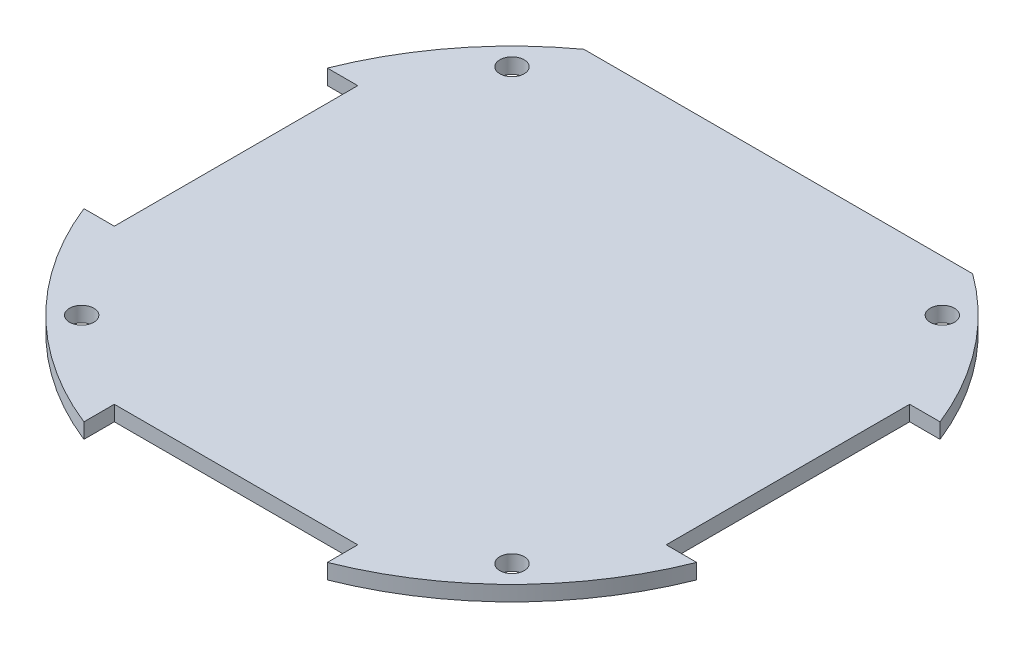
ISO-10303-21;
HEADER;
FILE_DESCRIPTION(('STEP AP214'),'2;1');
FILE_NAME('part.step','',(''),(''),'','','');
FILE_SCHEMA(('AUTOMOTIVE_DESIGN { 1 0 10303 214 1 1 1 1 }'));
ENDSEC;
DATA;
#1=APPLICATION_CONTEXT('core data for automotive mechanical design processes');
#2=APPLICATION_PROTOCOL_DEFINITION('international standard','automotive_design',2000,#1);
#3=PRODUCT_CONTEXT('',#1,'mechanical');
#4=PRODUCT('Part','Part','',(#3));
#5=PRODUCT_RELATED_PRODUCT_CATEGORY('part','',(#4));
#6=PRODUCT_DEFINITION_FORMATION('','',#4);
#7=PRODUCT_DEFINITION_CONTEXT('part definition',#1,'design');
#8=PRODUCT_DEFINITION('design','',#6,#7);
#9=PRODUCT_DEFINITION_SHAPE('','',#8);
#10=(LENGTH_UNIT() NAMED_UNIT(*) SI_UNIT(.MILLI.,.METRE.));
#11=(NAMED_UNIT(*) PLANE_ANGLE_UNIT() SI_UNIT($,.RADIAN.));
#12=(NAMED_UNIT(*) SI_UNIT($,.STERADIAN.) SOLID_ANGLE_UNIT());
#13=UNCERTAINTY_MEASURE_WITH_UNIT(LENGTH_MEASURE(1.E-05),#10,'distance_accuracy_value','');
#14=(GEOMETRIC_REPRESENTATION_CONTEXT(3) GLOBAL_UNCERTAINTY_ASSIGNED_CONTEXT((#13)) GLOBAL_UNIT_ASSIGNED_CONTEXT((#10,
#11,#12)) REPRESENTATION_CONTEXT('',''));
#15=CARTESIAN_POINT('',(0.,0.,0.));
#16=DIRECTION('',(0.,0.,1.));
#17=DIRECTION('',(1.,0.,0.));
#18=AXIS2_PLACEMENT_3D('',#15,#16,#17);
#19=CARTESIAN_POINT('',(0.,1.5,0.));
#20=DIRECTION('',(0.,-1.,0.));
#21=DIRECTION('',(0.,0.,-1.));
#22=AXIS2_PLACEMENT_3D('',#19,#20,#21);
#23=CYLINDRICAL_SURFACE('',#22,32.5);
#24=CARTESIAN_POINT('',(0.,0.,0.));
#25=DIRECTION('',(0.,1.,0.));
#26=DIRECTION('',(0.,0.,1.));
#27=AXIS2_PLACEMENT_3D('',#24,#25,#26);
#28=CIRCLE('',#27,32.5);
#29=CARTESIAN_POINT('',(11.9999999999999,0.,30.203476621078));
#30=VERTEX_POINT('',#29);
#31=CARTESIAN_POINT('',(30.2034766210779,0.,12.));
#32=VERTEX_POINT('',#31);
#33=EDGE_CURVE('E168',#30,#32,#28,.T.);
#34=ORIENTED_EDGE('',*,*,#33,.T.);
#35=DIRECTION('',(0.,1.,0.));
#36=VECTOR('',#35,1.);
#37=CARTESIAN_POINT('',(30.2034766210779,0.,12.));
#38=LINE('',#37,#36);
#39=CARTESIAN_POINT('',(30.2034766210779,1.5,12.));
#40=VERTEX_POINT('',#39);
#41=EDGE_CURVE('E190',#32,#40,#38,.T.);
#42=ORIENTED_EDGE('',*,*,#41,.T.);
#43=CARTESIAN_POINT('',(0.,1.5,0.));
#44=DIRECTION('',(0.,1.,0.));
#45=DIRECTION('',(0.,0.,1.));
#46=AXIS2_PLACEMENT_3D('',#43,#44,#45);
#47=CIRCLE('',#46,32.5);
#48=CARTESIAN_POINT('',(11.9999999999999,1.5,30.203476621078));
#49=VERTEX_POINT('',#48);
#50=EDGE_CURVE('E52',#49,#40,#47,.T.);
#51=ORIENTED_EDGE('',*,*,#50,.F.);
#52=DIRECTION('',(0.,1.,0.));
#53=VECTOR('',#52,1.);
#54=CARTESIAN_POINT('',(11.9999999999999,0.,30.203476621078));
#55=LINE('',#54,#53);
#56=EDGE_CURVE('E183',#30,#49,#55,.T.);
#57=ORIENTED_EDGE('',*,*,#56,.F.);
#58=EDGE_LOOP('',(#34,#42,#51,#57));
#59=FACE_BOUND('',#58,.T.);
#60=ADVANCED_FACE('F44',(#59),#23,.T.);
#61=CARTESIAN_POINT('',(-30.203476621078,0.,11.9999999999998));
#62=VERTEX_POINT('',#61);
#63=CARTESIAN_POINT('',(-12.0000000000001,0.,30.2034766210779));
#64=VERTEX_POINT('',#63);
#65=EDGE_CURVE('E267',#62,#64,#28,.T.);
#66=ORIENTED_EDGE('',*,*,#65,.T.);
#67=DIRECTION('',(0.,1.,0.));
#68=VECTOR('',#67,1.);
#69=CARTESIAN_POINT('',(-12.0000000000001,0.,30.2034766210779));
#70=LINE('',#69,#68);
#71=CARTESIAN_POINT('',(-12.0000000000001,1.5,30.2034766210779));
#72=VERTEX_POINT('',#71);
#73=EDGE_CURVE('E215',#64,#72,#70,.T.);
#74=ORIENTED_EDGE('',*,*,#73,.T.);
#75=CARTESIAN_POINT('',(-30.203476621078,1.5,11.9999999999998));
#76=VERTEX_POINT('',#75);
#77=EDGE_CURVE('E170',#76,#72,#47,.T.);
#78=ORIENTED_EDGE('',*,*,#77,.F.);
#79=DIRECTION('',(0.,1.,0.));
#80=VECTOR('',#79,1.);
#81=CARTESIAN_POINT('',(-30.203476621078,0.,11.9999999999998));
#82=LINE('',#81,#80);
#83=EDGE_CURVE('E233',#62,#76,#82,.T.);
#84=ORIENTED_EDGE('',*,*,#83,.F.);
#85=EDGE_LOOP('',(#66,#74,#78,#84));
#86=FACE_BOUND('',#85,.T.);
#87=ADVANCED_FACE('F292',(#86),#23,.T.);
#88=CARTESIAN_POINT('',(-19.1621371459443,1.5,-26.2500000000004));
#89=VERTEX_POINT('',#88);
#90=CARTESIAN_POINT('',(-30.2034766210778,1.5,-12.0000000000002));
#91=VERTEX_POINT('',#90);
#92=EDGE_CURVE('E160',#89,#91,#47,.T.);
#93=ORIENTED_EDGE('',*,*,#92,.F.);
#94=DIRECTION('',(0.,-1.,0.));
#95=VECTOR('',#94,1.);
#96=CARTESIAN_POINT('',(-19.1621371459443,1.5,-26.2500000000004));
#97=LINE('',#96,#95);
#98=CARTESIAN_POINT('',(-19.1621371459443,0.,-26.2499999999999));
#99=VERTEX_POINT('',#98);
#100=EDGE_CURVE('E141',#89,#99,#97,.T.);
#101=ORIENTED_EDGE('',*,*,#100,.T.);
#102=CARTESIAN_POINT('',(-30.2034766210778,0.,-12.0000000000002));
#103=VERTEX_POINT('',#102);
#104=EDGE_CURVE('E304',#99,#103,#28,.T.);
#105=ORIENTED_EDGE('',*,*,#104,.T.);
#106=DIRECTION('',(0.,1.,0.));
#107=VECTOR('',#106,1.);
#108=CARTESIAN_POINT('',(-30.2034766210778,0.,-12.0000000000002));
#109=LINE('',#108,#107);
#110=EDGE_CURVE('E147',#103,#91,#109,.T.);
#111=ORIENTED_EDGE('',*,*,#110,.T.);
#112=EDGE_LOOP('',(#93,#101,#105,#111));
#113=FACE_BOUND('',#112,.T.);
#114=ADVANCED_FACE('F164',(#113),#23,.T.);
#115=CARTESIAN_POINT('',(0.,1.5,0.));
#116=DIRECTION('',(0.,1.,0.));
#117=DIRECTION('',(0.,0.,1.));
#118=AXIS2_PLACEMENT_3D('',#115,#116,#117);
#119=PLANE('',#118);
#120=DIRECTION('',(1.,0.,0.));
#121=VECTOR('',#120,1.);
#122=CARTESIAN_POINT('',(16.9999999999999,1.5,-26.2499999999999));
#123=LINE('',#122,#121);
#124=CARTESIAN_POINT('',(19.162137145945,1.5,-26.2499999999999));
#125=VERTEX_POINT('',#124);
#126=EDGE_CURVE('E58',#89,#125,#123,.T.);
#127=ORIENTED_EDGE('',*,*,#126,.F.);
#128=ORIENTED_EDGE('',*,*,#92,.T.);
#129=DIRECTION('',(-1.,0.,0.));
#130=VECTOR('',#129,1.);
#131=CARTESIAN_POINT('',(-30.2034766210778,1.5,-12.0000000000002));
#132=LINE('',#131,#130);
#133=CARTESIAN_POINT('',(-27.2034766210778,1.5,-12.0000000000002));
#134=VERTEX_POINT('',#133);
#135=EDGE_CURVE('E239',#134,#91,#132,.T.);
#136=ORIENTED_EDGE('',*,*,#135,.F.);
#137=DIRECTION('',(0.,0.,-1.));
#138=VECTOR('',#137,1.);
#139=CARTESIAN_POINT('',(-27.203476621078,1.5,11.9999999999998));
#140=LINE('',#139,#138);
#141=CARTESIAN_POINT('',(-27.203476621078,1.5,11.9999999999998));
#142=VERTEX_POINT('',#141);
#143=EDGE_CURVE('E243',#142,#134,#140,.T.);
#144=ORIENTED_EDGE('',*,*,#143,.F.);
#145=DIRECTION('',(1.,0.,0.));
#146=VECTOR('',#145,1.);
#147=CARTESIAN_POINT('',(-30.203476621078,1.5,11.9999999999998));
#148=LINE('',#147,#146);
#149=EDGE_CURVE('E214',#76,#142,#148,.T.);
#150=ORIENTED_EDGE('',*,*,#149,.F.);
#151=ORIENTED_EDGE('',*,*,#77,.T.);
#152=DIRECTION('',(0.,0.,1.));
#153=VECTOR('',#152,1.);
#154=CARTESIAN_POINT('',(-12.0000000000001,1.5,30.2034766210779));
#155=LINE('',#154,#153);
#156=CARTESIAN_POINT('',(-12.0000000000001,1.5,27.2034766210779));
#157=VERTEX_POINT('',#156);
#158=EDGE_CURVE('E216',#157,#72,#155,.T.);
#159=ORIENTED_EDGE('',*,*,#158,.F.);
#160=DIRECTION('',(-1.,0.,0.));
#161=VECTOR('',#160,1.);
#162=CARTESIAN_POINT('',(11.9999999999999,1.5,27.203476621078));
#163=LINE('',#162,#161);
#164=CARTESIAN_POINT('',(11.9999999999999,1.5,27.203476621078));
#165=VERTEX_POINT('',#164);
#166=EDGE_CURVE('E217',#165,#157,#163,.T.);
#167=ORIENTED_EDGE('',*,*,#166,.F.);
#168=DIRECTION('',(0.,0.,-1.));
#169=VECTOR('',#168,1.);
#170=CARTESIAN_POINT('',(11.9999999999999,1.5,30.203476621078));
#171=LINE('',#170,#169);
#172=EDGE_CURVE('E179',#49,#165,#171,.T.);
#173=ORIENTED_EDGE('',*,*,#172,.F.);
#174=ORIENTED_EDGE('',*,*,#50,.T.);
#175=DIRECTION('',(1.,0.,0.));
#176=VECTOR('',#175,1.);
#177=CARTESIAN_POINT('',(30.2034766210779,1.5,12.));
#178=LINE('',#177,#176);
#179=CARTESIAN_POINT('',(27.2034766210779,1.5,12.));
#180=VERTEX_POINT('',#179);
#181=EDGE_CURVE('E180',#180,#40,#178,.T.);
#182=ORIENTED_EDGE('',*,*,#181,.F.);
#183=DIRECTION('',(0.,0.,1.));
#184=VECTOR('',#183,1.);
#185=CARTESIAN_POINT('',(27.2034766210779,1.5,-12.));
#186=LINE('',#185,#184);
#187=CARTESIAN_POINT('',(27.2034766210779,1.5,-12.));
#188=VERTEX_POINT('',#187);
#189=EDGE_CURVE('E323',#188,#180,#186,.T.);
#190=ORIENTED_EDGE('',*,*,#189,.F.);
#191=DIRECTION('',(-1.,0.,0.));
#192=VECTOR('',#191,1.);
#193=CARTESIAN_POINT('',(30.2034766210779,1.5,-12.));
#194=LINE('',#193,#192);
#195=CARTESIAN_POINT('',(30.2034766210779,1.5,-12.));
#196=VERTEX_POINT('',#195);
#197=EDGE_CURVE('E224',#196,#188,#194,.T.);
#198=ORIENTED_EDGE('',*,*,#197,.F.);
#199=EDGE_CURVE('E161',#196,#125,#47,.T.);
#200=ORIENTED_EDGE('',*,*,#199,.T.);
#201=EDGE_LOOP('',(#127,#128,#136,#144,#150,#151,#159,#167,#173,#174,#182,#190,#198,#200));
#202=FACE_BOUND('',#201,.T.);
#203=CARTESIAN_POINT('',(-21.2132034355974,1.5,21.2132034355974));
#204=DIRECTION('',(0.,1.,0.));
#205=DIRECTION('',(0.,0.,1.));
#206=AXIS2_PLACEMENT_3D('',#203,#204,#205);
#207=CIRCLE('',#206,1.19999999999986);
#208=CARTESIAN_POINT('',(-21.2132034355974,1.5,22.4132034355973));
#209=VERTEX_POINT('',#208);
#210=EDGE_CURVE('E254',#209,#209,#207,.T.);
#211=ORIENTED_EDGE('',*,*,#210,.F.);
#212=EDGE_LOOP('',(#211));
#213=FACE_BOUND('',#212,.T.);
#214=CARTESIAN_POINT('',(21.2132034355968,1.5,-21.213203435596));
#215=DIRECTION('',(0.,1.,0.));
#216=DIRECTION('',(0.,0.,1.));
#217=AXIS2_PLACEMENT_3D('',#214,#215,#216);
#218=CIRCLE('',#217,1.2);
#219=CARTESIAN_POINT('',(21.2132034355968,1.5,-20.013203435596));
#220=VERTEX_POINT('',#219);
#221=EDGE_CURVE('E270',#220,#220,#218,.T.);
#222=ORIENTED_EDGE('',*,*,#221,.F.);
#223=EDGE_LOOP('',(#222));
#224=FACE_BOUND('',#223,.T.);
#225=CARTESIAN_POINT('',(21.2132034355964,1.5,21.2132034355978));
#226=DIRECTION('',(0.,1.,0.));
#227=DIRECTION('',(0.,0.,1.));
#228=AXIS2_PLACEMENT_3D('',#225,#226,#227);
#229=CIRCLE('',#228,1.19999999999894);
#230=CARTESIAN_POINT('',(21.2132034355964,1.5,22.4132034355967));
#231=VERTEX_POINT('',#230);
#232=EDGE_CURVE('E261',#231,#231,#229,.T.);
#233=ORIENTED_EDGE('',*,*,#232,.F.);
#234=EDGE_LOOP('',(#233));
#235=FACE_BOUND('',#234,.T.);
#236=CARTESIAN_POINT('',(-21.213203435597,1.5,-21.2132034355964));
#237=DIRECTION('',(0.,1.,0.));
#238=DIRECTION('',(0.,0.,1.));
#239=AXIS2_PLACEMENT_3D('',#236,#237,#238);
#240=CIRCLE('',#239,1.20000000000061);
#241=CARTESIAN_POINT('',(-21.213203435597,1.5,-20.0132034355958));
#242=VERTEX_POINT('',#241);
#243=EDGE_CURVE('E194',#242,#242,#240,.T.);
#244=ORIENTED_EDGE('',*,*,#243,.F.);
#245=EDGE_LOOP('',(#244));
#246=FACE_BOUND('',#245,.T.);
#247=ADVANCED_FACE('F152',(#202,#213,#224,#235,#246),#119,.T.);
#248=CARTESIAN_POINT('',(0.,0.,0.));
#249=DIRECTION('',(0.,1.,0.));
#250=DIRECTION('',(0.,0.,1.));
#251=AXIS2_PLACEMENT_3D('',#248,#249,#250);
#252=PLANE('',#251);
#253=CARTESIAN_POINT('',(-2.99999999999997,0.,21.203476621078));
#254=DIRECTION('',(0.,-1.,0.));
#255=DIRECTION('',(0.,0.,-1.));
#256=AXIS2_PLACEMENT_3D('',#253,#254,#255);
#257=CIRCLE('',#256,1.);
#258=CARTESIAN_POINT('',(-2.99999999999997,0.,20.203476621078));
#259=VERTEX_POINT('',#258);
#260=EDGE_CURVE('E378',#259,#259,#257,.T.);
#261=ORIENTED_EDGE('',*,*,#260,.F.);
#262=EDGE_LOOP('',(#261));
#263=FACE_BOUND('',#262,.T.);
#264=CARTESIAN_POINT('',(-3.,0.,24.203476621078));
#265=DIRECTION('',(0.,-1.,0.));
#266=DIRECTION('',(0.,0.,-1.));
#267=AXIS2_PLACEMENT_3D('',#264,#265,#266);
#268=CIRCLE('',#267,1.);
#269=CARTESIAN_POINT('',(-3.,0.,23.203476621078));
#270=VERTEX_POINT('',#269);
#271=EDGE_CURVE('E385',#270,#270,#268,.T.);
#272=ORIENTED_EDGE('',*,*,#271,.F.);
#273=EDGE_LOOP('',(#272));
#274=FACE_BOUND('',#273,.T.);
#275=CARTESIAN_POINT('',(-6.,0.,24.203476621078));
#276=DIRECTION('',(0.,-1.,0.));
#277=DIRECTION('',(0.,0.,-1.));
#278=AXIS2_PLACEMENT_3D('',#275,#276,#277);
#279=CIRCLE('',#278,1.);
#280=CARTESIAN_POINT('',(-6.,0.,23.203476621078));
#281=VERTEX_POINT('',#280);
#282=EDGE_CURVE('E387',#281,#281,#279,.T.);
#283=ORIENTED_EDGE('',*,*,#282,.F.);
#284=EDGE_LOOP('',(#283));
#285=FACE_BOUND('',#284,.T.);
#286=CARTESIAN_POINT('',(3.,0.,18.203476621078));
#287=DIRECTION('',(0.,-1.,0.));
#288=DIRECTION('',(0.,0.,-1.));
#289=AXIS2_PLACEMENT_3D('',#286,#287,#288);
#290=CIRCLE('',#289,1.5);
#291=CARTESIAN_POINT('',(3.,0.,16.703476621078));
#292=VERTEX_POINT('',#291);
#293=EDGE_CURVE('E388',#292,#292,#290,.T.);
#294=ORIENTED_EDGE('',*,*,#293,.F.);
#295=EDGE_LOOP('',(#294));
#296=FACE_BOUND('',#295,.T.);
#297=CARTESIAN_POINT('',(-5.99999999999997,0.,21.203476621078));
#298=DIRECTION('',(0.,-1.,0.));
#299=DIRECTION('',(0.,0.,-1.));
#300=AXIS2_PLACEMENT_3D('',#297,#298,#299);
#301=CIRCLE('',#300,1.);
#302=CARTESIAN_POINT('',(-5.99999999999997,0.,20.203476621078));
#303=VERTEX_POINT('',#302);
#304=EDGE_CURVE('E394',#303,#303,#301,.T.);
#305=ORIENTED_EDGE('',*,*,#304,.F.);
#306=EDGE_LOOP('',(#305));
#307=FACE_BOUND('',#306,.T.);
#308=CARTESIAN_POINT('',(3.,0.,22.203476621078));
#309=DIRECTION('',(0.,-1.,0.));
#310=DIRECTION('',(0.,0.,-1.));
#311=AXIS2_PLACEMENT_3D('',#308,#309,#310);
#312=CIRCLE('',#311,1.5);
#313=CARTESIAN_POINT('',(3.,0.,20.703476621078));
#314=VERTEX_POINT('',#313);
#315=EDGE_CURVE('E312',#314,#314,#312,.T.);
#316=ORIENTED_EDGE('',*,*,#315,.F.);
#317=EDGE_LOOP('',(#316));
#318=FACE_BOUND('',#317,.T.);
#319=ORIENTED_EDGE('',*,*,#104,.F.);
#320=DIRECTION('',(1.,0.,0.));
#321=VECTOR('',#320,1.);
#322=CARTESIAN_POINT('',(16.9999999999999,0.,-26.2499999999999));
#323=LINE('',#322,#321);
#324=CARTESIAN_POINT('',(19.162137145945,0.,-26.2499999999999));
#325=VERTEX_POINT('',#324);
#326=EDGE_CURVE('E148',#99,#325,#323,.T.);
#327=ORIENTED_EDGE('',*,*,#326,.T.);
#328=CARTESIAN_POINT('',(30.2034766210779,0.,-12.));
#329=VERTEX_POINT('',#328);
#330=EDGE_CURVE('E308',#329,#325,#28,.T.);
#331=ORIENTED_EDGE('',*,*,#330,.F.);
#332=DIRECTION('',(-1.,0.,0.));
#333=VECTOR('',#332,1.);
#334=CARTESIAN_POINT('',(30.2034766210779,0.,-12.));
#335=LINE('',#334,#333);
#336=CARTESIAN_POINT('',(27.2034766210779,0.,-12.));
#337=VERTEX_POINT('',#336);
#338=EDGE_CURVE('E315',#329,#337,#335,.T.);
#339=ORIENTED_EDGE('',*,*,#338,.T.);
#340=DIRECTION('',(0.,0.,1.));
#341=VECTOR('',#340,1.);
#342=CARTESIAN_POINT('',(27.2034766210779,0.,-12.));
#343=LINE('',#342,#341);
#344=CARTESIAN_POINT('',(27.2034766210779,0.,12.));
#345=VERTEX_POINT('',#344);
#346=EDGE_CURVE('E317',#337,#345,#343,.T.);
#347=ORIENTED_EDGE('',*,*,#346,.T.);
#348=DIRECTION('',(1.,0.,0.));
#349=VECTOR('',#348,1.);
#350=CARTESIAN_POINT('',(30.2034766210779,0.,12.));
#351=LINE('',#350,#349);
#352=EDGE_CURVE('E202',#345,#32,#351,.T.);
#353=ORIENTED_EDGE('',*,*,#352,.T.);
#354=ORIENTED_EDGE('',*,*,#33,.F.);
#355=DIRECTION('',(0.,0.,-1.));
#356=VECTOR('',#355,1.);
#357=CARTESIAN_POINT('',(11.9999999999999,0.,30.203476621078));
#358=LINE('',#357,#356);
#359=CARTESIAN_POINT('',(11.9999999999999,0.,27.203476621078));
#360=VERTEX_POINT('',#359);
#361=EDGE_CURVE('E218',#30,#360,#358,.T.);
#362=ORIENTED_EDGE('',*,*,#361,.T.);
#363=DIRECTION('',(-1.,0.,0.));
#364=VECTOR('',#363,1.);
#365=CARTESIAN_POINT('',(11.9999999999999,0.,27.203476621078));
#366=LINE('',#365,#364);
#367=CARTESIAN_POINT('',(-12.0000000000001,0.,27.2034766210779));
#368=VERTEX_POINT('',#367);
#369=EDGE_CURVE('E228',#360,#368,#366,.T.);
#370=ORIENTED_EDGE('',*,*,#369,.T.);
#371=DIRECTION('',(0.,0.,1.));
#372=VECTOR('',#371,1.);
#373=CARTESIAN_POINT('',(-12.0000000000001,0.,30.2034766210779));
#374=LINE('',#373,#372);
#375=EDGE_CURVE('E210',#368,#64,#374,.T.);
#376=ORIENTED_EDGE('',*,*,#375,.T.);
#377=ORIENTED_EDGE('',*,*,#65,.F.);
#378=DIRECTION('',(1.,0.,0.));
#379=VECTOR('',#378,1.);
#380=CARTESIAN_POINT('',(-30.203476621078,0.,11.9999999999998));
#381=LINE('',#380,#379);
#382=CARTESIAN_POINT('',(-27.203476621078,0.,11.9999999999998));
#383=VERTEX_POINT('',#382);
#384=EDGE_CURVE('E70',#62,#383,#381,.T.);
#385=ORIENTED_EDGE('',*,*,#384,.T.);
#386=DIRECTION('',(0.,0.,-1.));
#387=VECTOR('',#386,1.);
#388=CARTESIAN_POINT('',(-27.203476621078,0.,11.9999999999998));
#389=LINE('',#388,#387);
#390=CARTESIAN_POINT('',(-27.2034766210778,0.,-12.0000000000002));
#391=VERTEX_POINT('',#390);
#392=EDGE_CURVE('E246',#383,#391,#389,.T.);
#393=ORIENTED_EDGE('',*,*,#392,.T.);
#394=DIRECTION('',(-1.,0.,0.));
#395=VECTOR('',#394,1.);
#396=CARTESIAN_POINT('',(-30.2034766210778,0.,-12.0000000000002));
#397=LINE('',#396,#395);
#398=EDGE_CURVE('E231',#391,#103,#397,.T.);
#399=ORIENTED_EDGE('',*,*,#398,.T.);
#400=EDGE_LOOP('',(#319,#327,#331,#339,#347,#353,#354,#362,#370,#376,#377,#385,#393,#399));
#401=FACE_BOUND('',#400,.T.);
#402=CARTESIAN_POINT('',(21.2132034355968,0.,-21.213203435596));
#403=DIRECTION('',(0.,1.,0.));
#404=DIRECTION('',(0.,0.,1.));
#405=AXIS2_PLACEMENT_3D('',#402,#403,#404);
#406=CIRCLE('',#405,1.2);
#407=CARTESIAN_POINT('',(21.2132034355968,0.,-20.013203435596));
#408=VERTEX_POINT('',#407);
#409=EDGE_CURVE('E262',#408,#408,#406,.T.);
#410=ORIENTED_EDGE('',*,*,#409,.T.);
#411=EDGE_LOOP('',(#410));
#412=FACE_BOUND('',#411,.T.);
#413=CARTESIAN_POINT('',(21.2132034355964,0.,21.2132034355978));
#414=DIRECTION('',(0.,1.,0.));
#415=DIRECTION('',(0.,0.,1.));
#416=AXIS2_PLACEMENT_3D('',#413,#414,#415);
#417=CIRCLE('',#416,1.19999999999894);
#418=CARTESIAN_POINT('',(21.2132034355964,0.,22.4132034355967));
#419=VERTEX_POINT('',#418);
#420=EDGE_CURVE('E256',#419,#419,#417,.T.);
#421=ORIENTED_EDGE('',*,*,#420,.T.);
#422=EDGE_LOOP('',(#421));
#423=FACE_BOUND('',#422,.T.);
#424=CARTESIAN_POINT('',(-21.2132034355974,0.,21.2132034355974));
#425=DIRECTION('',(0.,1.,0.));
#426=DIRECTION('',(0.,0.,1.));
#427=AXIS2_PLACEMENT_3D('',#424,#425,#426);
#428=CIRCLE('',#427,1.19999999999986);
#429=CARTESIAN_POINT('',(-21.2132034355974,0.,22.4132034355973));
#430=VERTEX_POINT('',#429);
#431=EDGE_CURVE('E251',#430,#430,#428,.T.);
#432=ORIENTED_EDGE('',*,*,#431,.T.);
#433=EDGE_LOOP('',(#432));
#434=FACE_BOUND('',#433,.T.);
#435=CARTESIAN_POINT('',(-21.213203435597,0.,-21.2132034355964));
#436=DIRECTION('',(0.,1.,0.));
#437=DIRECTION('',(0.,0.,1.));
#438=AXIS2_PLACEMENT_3D('',#435,#436,#437);
#439=CIRCLE('',#438,1.20000000000061);
#440=CARTESIAN_POINT('',(-21.213203435597,0.,-20.0132034355958));
#441=VERTEX_POINT('',#440);
#442=EDGE_CURVE('E193',#441,#441,#439,.T.);
#443=ORIENTED_EDGE('',*,*,#442,.T.);
#444=EDGE_LOOP('',(#443));
#445=FACE_BOUND('',#444,.T.);
#446=ADVANCED_FACE('F272',(#263,#274,#285,#296,#307,#318,#401,#412,#423,#434,#445),#252,.F.);
#447=ORIENTED_EDGE('',*,*,#330,.T.);
#448=DIRECTION('',(0.,-1.,0.));
#449=VECTOR('',#448,1.);
#450=CARTESIAN_POINT('',(19.162137145945,1.5,-26.2499999999999));
#451=LINE('',#450,#449);
#452=EDGE_CURVE('E11',#325,#125,#451,.F.);
#453=ORIENTED_EDGE('',*,*,#452,.T.);
#454=ORIENTED_EDGE('',*,*,#199,.F.);
#455=DIRECTION('',(0.,1.,0.));
#456=VECTOR('',#455,1.);
#457=CARTESIAN_POINT('',(30.2034766210779,0.,-12.));
#458=LINE('',#457,#456);
#459=EDGE_CURVE('E201',#329,#196,#458,.T.);
#460=ORIENTED_EDGE('',*,*,#459,.F.);
#461=EDGE_LOOP('',(#447,#453,#454,#460));
#462=FACE_BOUND('',#461,.T.);
#463=ADVANCED_FACE('F50',(#462),#23,.T.);
#464=CARTESIAN_POINT('',(21.2132034355968,1.5,-21.213203435596));
#465=DIRECTION('',(0.,-1.,0.));
#466=DIRECTION('',(0.,0.,-1.));
#467=AXIS2_PLACEMENT_3D('',#464,#465,#466);
#468=CYLINDRICAL_SURFACE('',#467,1.2);
#469=ORIENTED_EDGE('',*,*,#221,.T.);
#470=EDGE_LOOP('',(#469));
#471=FACE_BOUND('',#470,.T.);
#472=ORIENTED_EDGE('',*,*,#409,.F.);
#473=EDGE_LOOP('',(#472));
#474=FACE_BOUND('',#473,.T.);
#475=ADVANCED_FACE('F277',(#471,#474),#468,.F.);
#476=CARTESIAN_POINT('',(21.2132034355964,1.5,21.2132034355978));
#477=DIRECTION('',(0.,-1.,0.));
#478=DIRECTION('',(0.,0.,-1.));
#479=AXIS2_PLACEMENT_3D('',#476,#477,#478);
#480=CYLINDRICAL_SURFACE('',#479,1.19999999999894);
#481=ORIENTED_EDGE('',*,*,#232,.T.);
#482=EDGE_LOOP('',(#481));
#483=FACE_BOUND('',#482,.T.);
#484=ORIENTED_EDGE('',*,*,#420,.F.);
#485=EDGE_LOOP('',(#484));
#486=FACE_BOUND('',#485,.T.);
#487=ADVANCED_FACE('F279',(#483,#486),#480,.F.);
#488=CARTESIAN_POINT('',(-21.2132034355974,1.5,21.2132034355974));
#489=DIRECTION('',(0.,-1.,0.));
#490=DIRECTION('',(0.,0.,-1.));
#491=AXIS2_PLACEMENT_3D('',#488,#489,#490);
#492=CYLINDRICAL_SURFACE('',#491,1.19999999999986);
#493=ORIENTED_EDGE('',*,*,#210,.T.);
#494=EDGE_LOOP('',(#493));
#495=FACE_BOUND('',#494,.T.);
#496=ORIENTED_EDGE('',*,*,#431,.F.);
#497=EDGE_LOOP('',(#496));
#498=FACE_BOUND('',#497,.T.);
#499=ADVANCED_FACE('F284',(#495,#498),#492,.F.);
#500=CARTESIAN_POINT('',(-21.213203435597,1.5,-21.2132034355964));
#501=DIRECTION('',(0.,-1.,0.));
#502=DIRECTION('',(0.,0.,-1.));
#503=AXIS2_PLACEMENT_3D('',#500,#501,#502);
#504=CYLINDRICAL_SURFACE('',#503,1.20000000000061);
#505=ORIENTED_EDGE('',*,*,#243,.T.);
#506=EDGE_LOOP('',(#505));
#507=FACE_BOUND('',#506,.T.);
#508=ORIENTED_EDGE('',*,*,#442,.F.);
#509=EDGE_LOOP('',(#508));
#510=FACE_BOUND('',#509,.T.);
#511=ADVANCED_FACE('F350',(#507,#510),#504,.F.);
#512=CARTESIAN_POINT('',(-30.2034766210778,0.,-12.0000000000002));
#513=DIRECTION('',(0.,0.,-1.));
#514=DIRECTION('',(-1.,0.,0.));
#515=AXIS2_PLACEMENT_3D('',#512,#513,#514);
#516=PLANE('',#515);
#517=ORIENTED_EDGE('',*,*,#135,.T.);
#518=ORIENTED_EDGE('',*,*,#110,.F.);
#519=ORIENTED_EDGE('',*,*,#398,.F.);
#520=DIRECTION('',(0.,1.,0.));
#521=VECTOR('',#520,1.);
#522=CARTESIAN_POINT('',(-27.2034766210778,0.,-12.0000000000002));
#523=LINE('',#522,#521);
#524=EDGE_CURVE('E237',#391,#134,#523,.T.);
#525=ORIENTED_EDGE('',*,*,#524,.T.);
#526=EDGE_LOOP('',(#517,#518,#519,#525));
#527=FACE_BOUND('',#526,.T.);
#528=ADVANCED_FACE('F347',(#527),#516,.F.);
#529=CARTESIAN_POINT('',(-27.203476621078,0.,11.9999999999998));
#530=DIRECTION('',(1.,0.,0.));
#531=DIRECTION('',(0.,0.,-1.));
#532=AXIS2_PLACEMENT_3D('',#529,#530,#531);
#533=PLANE('',#532);
#534=ORIENTED_EDGE('',*,*,#143,.T.);
#535=ORIENTED_EDGE('',*,*,#524,.F.);
#536=ORIENTED_EDGE('',*,*,#392,.F.);
#537=DIRECTION('',(0.,1.,0.));
#538=VECTOR('',#537,1.);
#539=CARTESIAN_POINT('',(-27.203476621078,0.,11.9999999999998));
#540=LINE('',#539,#538);
#541=EDGE_CURVE('E232',#383,#142,#540,.T.);
#542=ORIENTED_EDGE('',*,*,#541,.T.);
#543=EDGE_LOOP('',(#534,#535,#536,#542));
#544=FACE_BOUND('',#543,.T.);
#545=ADVANCED_FACE('F341',(#544),#533,.F.);
#546=CARTESIAN_POINT('',(-30.203476621078,0.,11.9999999999998));
#547=DIRECTION('',(0.,0.,1.));
#548=DIRECTION('',(1.,0.,0.));
#549=AXIS2_PLACEMENT_3D('',#546,#547,#548);
#550=PLANE('',#549);
#551=ORIENTED_EDGE('',*,*,#149,.T.);
#552=ORIENTED_EDGE('',*,*,#541,.F.);
#553=ORIENTED_EDGE('',*,*,#384,.F.);
#554=ORIENTED_EDGE('',*,*,#83,.T.);
#555=EDGE_LOOP('',(#551,#552,#553,#554));
#556=FACE_BOUND('',#555,.T.);
#557=ADVANCED_FACE('F337',(#556),#550,.F.);
#558=CARTESIAN_POINT('',(-12.0000000000001,0.,30.2034766210779));
#559=DIRECTION('',(-1.,0.,0.));
#560=DIRECTION('',(0.,0.,1.));
#561=AXIS2_PLACEMENT_3D('',#558,#559,#560);
#562=PLANE('',#561);
#563=ORIENTED_EDGE('',*,*,#158,.T.);
#564=ORIENTED_EDGE('',*,*,#73,.F.);
#565=ORIENTED_EDGE('',*,*,#375,.F.);
#566=DIRECTION('',(0.,1.,0.));
#567=VECTOR('',#566,1.);
#568=CARTESIAN_POINT('',(-12.0000000000001,0.,27.2034766210779));
#569=LINE('',#568,#567);
#570=EDGE_CURVE('E209',#368,#157,#569,.T.);
#571=ORIENTED_EDGE('',*,*,#570,.T.);
#572=EDGE_LOOP('',(#563,#564,#565,#571));
#573=FACE_BOUND('',#572,.T.);
#574=ADVANCED_FACE('F340',(#573),#562,.F.);
#575=CARTESIAN_POINT('',(11.9999999999999,0.,27.203476621078));
#576=DIRECTION('',(0.,0.,-1.));
#577=DIRECTION('',(-1.,0.,0.));
#578=AXIS2_PLACEMENT_3D('',#575,#576,#577);
#579=PLANE('',#578);
#580=ORIENTED_EDGE('',*,*,#166,.T.);
#581=ORIENTED_EDGE('',*,*,#570,.F.);
#582=ORIENTED_EDGE('',*,*,#369,.F.);
#583=DIRECTION('',(0.,1.,0.));
#584=VECTOR('',#583,1.);
#585=CARTESIAN_POINT('',(11.9999999999999,0.,27.203476621078));
#586=LINE('',#585,#584);
#587=EDGE_CURVE('E208',#360,#165,#586,.T.);
#588=ORIENTED_EDGE('',*,*,#587,.T.);
#589=EDGE_LOOP('',(#580,#581,#582,#588));
#590=FACE_BOUND('',#589,.T.);
#591=ADVANCED_FACE('F334',(#590),#579,.F.);
#592=CARTESIAN_POINT('',(11.9999999999999,0.,30.203476621078));
#593=DIRECTION('',(1.,0.,0.));
#594=DIRECTION('',(0.,0.,-1.));
#595=AXIS2_PLACEMENT_3D('',#592,#593,#594);
#596=PLANE('',#595);
#597=ORIENTED_EDGE('',*,*,#172,.T.);
#598=ORIENTED_EDGE('',*,*,#587,.F.);
#599=ORIENTED_EDGE('',*,*,#361,.F.);
#600=ORIENTED_EDGE('',*,*,#56,.T.);
#601=EDGE_LOOP('',(#597,#598,#599,#600));
#602=FACE_BOUND('',#601,.T.);
#603=ADVANCED_FACE('F332',(#602),#596,.F.);
#604=CARTESIAN_POINT('',(30.2034766210779,0.,12.));
#605=DIRECTION('',(0.,0.,1.));
#606=DIRECTION('',(1.,0.,0.));
#607=AXIS2_PLACEMENT_3D('',#604,#605,#606);
#608=PLANE('',#607);
#609=ORIENTED_EDGE('',*,*,#181,.T.);
#610=ORIENTED_EDGE('',*,*,#41,.F.);
#611=ORIENTED_EDGE('',*,*,#352,.F.);
#612=DIRECTION('',(0.,1.,0.));
#613=VECTOR('',#612,1.);
#614=CARTESIAN_POINT('',(27.2034766210779,0.,12.));
#615=LINE('',#614,#613);
#616=EDGE_CURVE('E195',#345,#180,#615,.T.);
#617=ORIENTED_EDGE('',*,*,#616,.T.);
#618=EDGE_LOOP('',(#609,#610,#611,#617));
#619=FACE_BOUND('',#618,.T.);
#620=ADVANCED_FACE('F326',(#619),#608,.F.);
#621=CARTESIAN_POINT('',(27.2034766210779,0.,-12.));
#622=DIRECTION('',(-1.,0.,0.));
#623=DIRECTION('',(0.,0.,1.));
#624=AXIS2_PLACEMENT_3D('',#621,#622,#623);
#625=PLANE('',#624);
#626=ORIENTED_EDGE('',*,*,#189,.T.);
#627=ORIENTED_EDGE('',*,*,#616,.F.);
#628=ORIENTED_EDGE('',*,*,#346,.F.);
#629=DIRECTION('',(0.,1.,0.));
#630=VECTOR('',#629,1.);
#631=CARTESIAN_POINT('',(27.2034766210779,0.,-12.));
#632=LINE('',#631,#630);
#633=EDGE_CURVE('E197',#337,#188,#632,.T.);
#634=ORIENTED_EDGE('',*,*,#633,.T.);
#635=EDGE_LOOP('',(#626,#627,#628,#634));
#636=FACE_BOUND('',#635,.T.);
#637=ADVANCED_FACE('F327',(#636),#625,.F.);
#638=CARTESIAN_POINT('',(30.2034766210779,0.,-12.));
#639=DIRECTION('',(0.,0.,-1.));
#640=DIRECTION('',(-1.,0.,0.));
#641=AXIS2_PLACEMENT_3D('',#638,#639,#640);
#642=PLANE('',#641);
#643=ORIENTED_EDGE('',*,*,#197,.T.);
#644=ORIENTED_EDGE('',*,*,#633,.F.);
#645=ORIENTED_EDGE('',*,*,#338,.F.);
#646=ORIENTED_EDGE('',*,*,#459,.T.);
#647=EDGE_LOOP('',(#643,#644,#645,#646));
#648=FACE_BOUND('',#647,.T.);
#649=ADVANCED_FACE('F480',(#648),#642,.F.);
#650=CARTESIAN_POINT('',(16.9999999999999,0.,-26.2499999999999));
#651=DIRECTION('',(0.,0.,1.));
#652=DIRECTION('',(1.,0.,0.));
#653=AXIS2_PLACEMENT_3D('',#650,#651,#652);
#654=PLANE('',#653);
#655=ORIENTED_EDGE('',*,*,#126,.T.);
#656=ORIENTED_EDGE('',*,*,#452,.F.);
#657=ORIENTED_EDGE('',*,*,#326,.F.);
#658=ORIENTED_EDGE('',*,*,#100,.F.);
#659=EDGE_LOOP('',(#655,#656,#657,#658));
#660=FACE_BOUND('',#659,.T.);
#661=ADVANCED_FACE('F145',(#660),#654,.F.);
#662=CARTESIAN_POINT('',(3.,0.1,22.203476621078));
#663=DIRECTION('',(0.,-1.,0.));
#664=DIRECTION('',(0.,0.,-1.));
#665=AXIS2_PLACEMENT_3D('',#662,#663,#664);
#666=CYLINDRICAL_SURFACE('',#665,1.5);
#667=CARTESIAN_POINT('',(3.,0.1,22.203476621078));
#668=DIRECTION('',(0.,-1.,0.));
#669=DIRECTION('',(0.,0.,-1.));
#670=AXIS2_PLACEMENT_3D('',#667,#668,#669);
#671=CIRCLE('',#670,1.5);
#672=CARTESIAN_POINT('',(3.,0.1,20.703476621078));
#673=VERTEX_POINT('',#672);
#674=EDGE_CURVE('E165',#673,#673,#671,.T.);
#675=ORIENTED_EDGE('',*,*,#674,.F.);
#676=EDGE_LOOP('',(#675));
#677=FACE_BOUND('',#676,.T.);
#678=ORIENTED_EDGE('',*,*,#315,.T.);
#679=EDGE_LOOP('',(#678));
#680=FACE_BOUND('',#679,.T.);
#681=ADVANCED_FACE('F442',(#677,#680),#666,.F.);
#682=CARTESIAN_POINT('',(3.,0.1,22.203476621078));
#683=DIRECTION('',(0.,-1.,0.));
#684=DIRECTION('',(0.,0.,-1.));
#685=AXIS2_PLACEMENT_3D('',#682,#683,#684);
#686=PLANE('',#685);
#687=ORIENTED_EDGE('',*,*,#674,.T.);
#688=EDGE_LOOP('',(#687));
#689=FACE_BOUND('',#688,.T.);
#690=ADVANCED_FACE('F433',(#689),#686,.T.);
#691=CARTESIAN_POINT('',(-5.99999999999997,0.1,21.203476621078));
#692=DIRECTION('',(0.,-1.,0.));
#693=DIRECTION('',(0.,0.,-1.));
#694=AXIS2_PLACEMENT_3D('',#691,#692,#693);
#695=CYLINDRICAL_SURFACE('',#694,1.);
#696=CARTESIAN_POINT('',(-5.99999999999997,0.1,21.203476621078));
#697=DIRECTION('',(0.,-1.,0.));
#698=DIRECTION('',(0.,0.,-1.));
#699=AXIS2_PLACEMENT_3D('',#696,#697,#698);
#700=CIRCLE('',#699,1.);
#701=CARTESIAN_POINT('',(-5.99999999999997,0.1,20.203476621078));
#702=VERTEX_POINT('',#701);
#703=EDGE_CURVE('E420',#702,#702,#700,.T.);
#704=ORIENTED_EDGE('',*,*,#703,.F.);
#705=EDGE_LOOP('',(#704));
#706=FACE_BOUND('',#705,.T.);
#707=ORIENTED_EDGE('',*,*,#304,.T.);
#708=EDGE_LOOP('',(#707));
#709=FACE_BOUND('',#708,.T.);
#710=ADVANCED_FACE('F431',(#706,#709),#695,.F.);
#711=CARTESIAN_POINT('',(-5.99999999999997,0.1,21.203476621078));
#712=DIRECTION('',(0.,-1.,0.));
#713=DIRECTION('',(0.,0.,-1.));
#714=AXIS2_PLACEMENT_3D('',#711,#712,#713);
#715=PLANE('',#714);
#716=ORIENTED_EDGE('',*,*,#703,.T.);
#717=EDGE_LOOP('',(#716));
#718=FACE_BOUND('',#717,.T.);
#719=ADVANCED_FACE('F427',(#718),#715,.T.);
#720=CARTESIAN_POINT('',(3.,0.1,18.203476621078));
#721=DIRECTION('',(0.,-1.,0.));
#722=DIRECTION('',(0.,0.,-1.));
#723=AXIS2_PLACEMENT_3D('',#720,#721,#722);
#724=CYLINDRICAL_SURFACE('',#723,1.5);
#725=CARTESIAN_POINT('',(3.,0.1,18.203476621078));
#726=DIRECTION('',(0.,-1.,0.));
#727=DIRECTION('',(0.,0.,-1.));
#728=AXIS2_PLACEMENT_3D('',#725,#726,#727);
#729=CIRCLE('',#728,1.5);
#730=CARTESIAN_POINT('',(3.,0.1,16.703476621078));
#731=VERTEX_POINT('',#730);
#732=EDGE_CURVE('E397',#731,#731,#729,.T.);
#733=ORIENTED_EDGE('',*,*,#732,.F.);
#734=EDGE_LOOP('',(#733));
#735=FACE_BOUND('',#734,.T.);
#736=ORIENTED_EDGE('',*,*,#293,.T.);
#737=EDGE_LOOP('',(#736));
#738=FACE_BOUND('',#737,.T.);
#739=ADVANCED_FACE('F438',(#735,#738),#724,.F.);
#740=CARTESIAN_POINT('',(3.,0.1,18.203476621078));
#741=DIRECTION('',(0.,-1.,0.));
#742=DIRECTION('',(0.,0.,-1.));
#743=AXIS2_PLACEMENT_3D('',#740,#741,#742);
#744=PLANE('',#743);
#745=ORIENTED_EDGE('',*,*,#732,.T.);
#746=EDGE_LOOP('',(#745));
#747=FACE_BOUND('',#746,.T.);
#748=ADVANCED_FACE('F461',(#747),#744,.T.);
#749=CARTESIAN_POINT('',(-6.,0.1,24.203476621078));
#750=DIRECTION('',(0.,-1.,0.));
#751=DIRECTION('',(0.,0.,-1.));
#752=AXIS2_PLACEMENT_3D('',#749,#750,#751);
#753=CYLINDRICAL_SURFACE('',#752,1.);
#754=CARTESIAN_POINT('',(-6.,0.1,24.203476621078));
#755=DIRECTION('',(0.,-1.,0.));
#756=DIRECTION('',(0.,0.,-1.));
#757=AXIS2_PLACEMENT_3D('',#754,#755,#756);
#758=CIRCLE('',#757,1.);
#759=CARTESIAN_POINT('',(-6.,0.1,23.203476621078));
#760=VERTEX_POINT('',#759);
#761=EDGE_CURVE('E409',#760,#760,#758,.T.);
#762=ORIENTED_EDGE('',*,*,#761,.F.);
#763=EDGE_LOOP('',(#762));
#764=FACE_BOUND('',#763,.T.);
#765=ORIENTED_EDGE('',*,*,#282,.T.);
#766=EDGE_LOOP('',(#765));
#767=FACE_BOUND('',#766,.T.);
#768=ADVANCED_FACE('F470',(#764,#767),#753,.F.);
#769=CARTESIAN_POINT('',(-6.,0.1,24.203476621078));
#770=DIRECTION('',(0.,-1.,0.));
#771=DIRECTION('',(0.,0.,-1.));
#772=AXIS2_PLACEMENT_3D('',#769,#770,#771);
#773=PLANE('',#772);
#774=ORIENTED_EDGE('',*,*,#761,.T.);
#775=EDGE_LOOP('',(#774));
#776=FACE_BOUND('',#775,.T.);
#777=ADVANCED_FACE('F449',(#776),#773,.T.);
#778=CARTESIAN_POINT('',(-3.,0.1,24.203476621078));
#779=DIRECTION('',(0.,-1.,0.));
#780=DIRECTION('',(0.,0.,-1.));
#781=AXIS2_PLACEMENT_3D('',#778,#779,#780);
#782=CYLINDRICAL_SURFACE('',#781,1.);
#783=CARTESIAN_POINT('',(-3.,0.1,24.203476621078));
#784=DIRECTION('',(0.,-1.,0.));
#785=DIRECTION('',(0.,0.,-1.));
#786=AXIS2_PLACEMENT_3D('',#783,#784,#785);
#787=CIRCLE('',#786,1.);
#788=CARTESIAN_POINT('',(-3.,0.1,23.203476621078));
#789=VERTEX_POINT('',#788);
#790=EDGE_CURVE('E411',#789,#789,#787,.T.);
#791=ORIENTED_EDGE('',*,*,#790,.F.);
#792=EDGE_LOOP('',(#791));
#793=FACE_BOUND('',#792,.T.);
#794=ORIENTED_EDGE('',*,*,#271,.T.);
#795=EDGE_LOOP('',(#794));
#796=FACE_BOUND('',#795,.T.);
#797=ADVANCED_FACE('F443',(#793,#796),#782,.F.);
#798=CARTESIAN_POINT('',(-3.,0.1,24.203476621078));
#799=DIRECTION('',(0.,-1.,0.));
#800=DIRECTION('',(0.,0.,-1.));
#801=AXIS2_PLACEMENT_3D('',#798,#799,#800);
#802=PLANE('',#801);
#803=ORIENTED_EDGE('',*,*,#790,.T.);
#804=EDGE_LOOP('',(#803));
#805=FACE_BOUND('',#804,.T.);
#806=ADVANCED_FACE('F446',(#805),#802,.T.);
#807=CARTESIAN_POINT('',(-2.99999999999997,0.1,21.203476621078));
#808=DIRECTION('',(0.,-1.,0.));
#809=DIRECTION('',(0.,0.,-1.));
#810=AXIS2_PLACEMENT_3D('',#807,#808,#809);
#811=CYLINDRICAL_SURFACE('',#810,1.);
#812=CARTESIAN_POINT('',(-2.99999999999997,0.1,21.203476621078));
#813=DIRECTION('',(0.,-1.,0.));
#814=DIRECTION('',(0.,0.,-1.));
#815=AXIS2_PLACEMENT_3D('',#812,#813,#814);
#816=CIRCLE('',#815,1.);
#817=CARTESIAN_POINT('',(-2.99999999999997,0.1,20.203476621078));
#818=VERTEX_POINT('',#817);
#819=EDGE_CURVE('E403',#818,#818,#816,.T.);
#820=ORIENTED_EDGE('',*,*,#819,.F.);
#821=EDGE_LOOP('',(#820));
#822=FACE_BOUND('',#821,.T.);
#823=ORIENTED_EDGE('',*,*,#260,.T.);
#824=EDGE_LOOP('',(#823));
#825=FACE_BOUND('',#824,.T.);
#826=ADVANCED_FACE('F451',(#822,#825),#811,.F.);
#827=CARTESIAN_POINT('',(-2.99999999999997,0.1,21.203476621078));
#828=DIRECTION('',(0.,-1.,0.));
#829=DIRECTION('',(0.,0.,-1.));
#830=AXIS2_PLACEMENT_3D('',#827,#828,#829);
#831=PLANE('',#830);
#832=ORIENTED_EDGE('',*,*,#819,.T.);
#833=EDGE_LOOP('',(#832));
#834=FACE_BOUND('',#833,.T.);
#835=ADVANCED_FACE('F460',(#834),#831,.T.);
#836=CLOSED_SHELL('',(#60,#87,#114,#247,#446,#463,#475,#487,#499,#511,#528,#545,#557,#574,#591,
#603,#620,#637,#649,#661,#681,#690,#710,#719,#739,#748,#768,#777,#797,#806,#826,#835));
#837=MANIFOLD_SOLID_BREP('B2',#836);
#838=ADVANCED_BREP_SHAPE_REPRESENTATION('',(#18,#837),#14);
#839=SHAPE_DEFINITION_REPRESENTATION(#9,#838);
ENDSEC;
END-ISO-10303-21;
